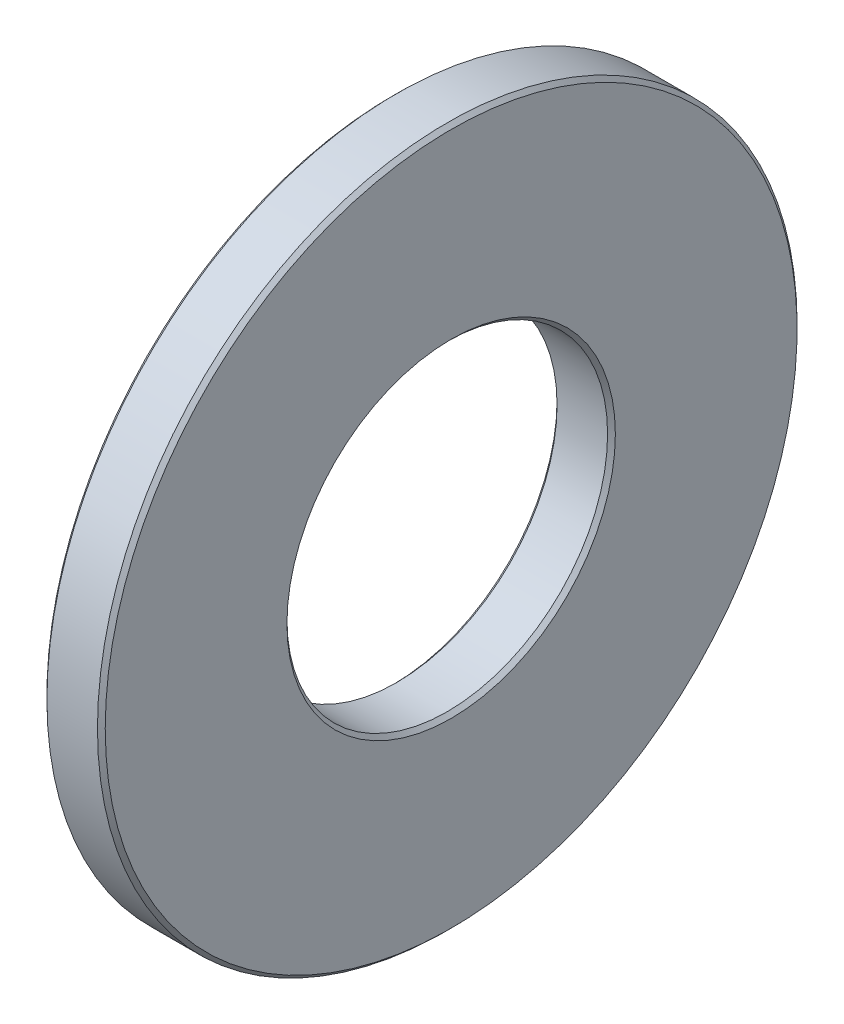
ISO-10303-21;
HEADER;
FILE_DESCRIPTION(('STEP AP214'),'2;1');
FILE_NAME('part.step','',(''),(''),'','','');
FILE_SCHEMA(('AUTOMOTIVE_DESIGN { 1 0 10303 214 1 1 1 1 }'));
ENDSEC;
DATA;
#1=APPLICATION_CONTEXT('core data for automotive mechanical design processes');
#2=APPLICATION_PROTOCOL_DEFINITION('international standard','automotive_design',2000,#1);
#3=PRODUCT_CONTEXT('',#1,'mechanical');
#4=PRODUCT('Part','Part','',(#3));
#5=PRODUCT_RELATED_PRODUCT_CATEGORY('part','',(#4));
#6=PRODUCT_DEFINITION_FORMATION('','',#4);
#7=PRODUCT_DEFINITION_CONTEXT('part definition',#1,'design');
#8=PRODUCT_DEFINITION('design','',#6,#7);
#9=PRODUCT_DEFINITION_SHAPE('','',#8);
#10=(LENGTH_UNIT() NAMED_UNIT(*) SI_UNIT(.MILLI.,.METRE.));
#11=(NAMED_UNIT(*) PLANE_ANGLE_UNIT() SI_UNIT($,.RADIAN.));
#12=(NAMED_UNIT(*) SI_UNIT($,.STERADIAN.) SOLID_ANGLE_UNIT());
#13=UNCERTAINTY_MEASURE_WITH_UNIT(LENGTH_MEASURE(1.E-05),#10,'distance_accuracy_value','');
#14=(GEOMETRIC_REPRESENTATION_CONTEXT(3) GLOBAL_UNCERTAINTY_ASSIGNED_CONTEXT((#13)) GLOBAL_UNIT_ASSIGNED_CONTEXT((#10,
#11,#12)) REPRESENTATION_CONTEXT('',''));
#15=CARTESIAN_POINT('',(0.,0.,0.));
#16=DIRECTION('',(0.,0.,1.));
#17=DIRECTION('',(1.,0.,0.));
#18=AXIS2_PLACEMENT_3D('',#15,#16,#17);
#19=CARTESIAN_POINT('',(0.,4.125,0.));
#20=DIRECTION('',(1.,0.,0.));
#21=DIRECTION('',(0.,0.,-1.));
#22=AXIS2_PLACEMENT_3D('',#19,#20,#21);
#23=PLANE('',#22);
#24=CARTESIAN_POINT('',(0.,0.,0.));
#25=DIRECTION('',(1.,0.,0.));
#26=DIRECTION('',(0.,0.,-1.));
#27=AXIS2_PLACEMENT_3D('',#24,#25,#26);
#28=CIRCLE('',#27,4.225);
#29=CARTESIAN_POINT('',(0.,0.,-4.225));
#30=VERTEX_POINT('',#29);
#31=EDGE_CURVE('E43',#30,#30,#28,.T.);
#32=ORIENTED_EDGE('',*,*,#31,.T.);
#33=EDGE_LOOP('',(#32));
#34=FACE_BOUND('',#33,.T.);
#35=CARTESIAN_POINT('',(0.,0.,0.));
#36=DIRECTION('',(1.,0.,0.));
#37=DIRECTION('',(0.,0.,-1.));
#38=AXIS2_PLACEMENT_3D('',#35,#36,#37);
#39=CIRCLE('',#38,8.9);
#40=CARTESIAN_POINT('',(0.,0.,-8.9));
#41=VERTEX_POINT('',#40);
#42=EDGE_CURVE('E47',#41,#41,#39,.F.);
#43=ORIENTED_EDGE('',*,*,#42,.T.);
#44=EDGE_LOOP('',(#43));
#45=FACE_BOUND('',#44,.T.);
#46=ADVANCED_FACE('F33',(#34,#45),#23,.F.);
#47=CARTESIAN_POINT('',(0.,0.,0.));
#48=DIRECTION('',(-1.,0.,0.));
#49=DIRECTION('',(0.,0.,1.));
#50=AXIS2_PLACEMENT_3D('',#47,#48,#49);
#51=CYLINDRICAL_SURFACE('',#50,9.);
#52=CARTESIAN_POINT('',(1.4,0.,0.));
#53=DIRECTION('',(-1.,0.,0.));
#54=DIRECTION('',(0.,0.,1.));
#55=AXIS2_PLACEMENT_3D('',#52,#53,#54);
#56=CIRCLE('',#55,9.);
#57=CARTESIAN_POINT('',(1.4,0.,9.));
#58=VERTEX_POINT('',#57);
#59=EDGE_CURVE('E10',#58,#58,#56,.T.);
#60=ORIENTED_EDGE('',*,*,#59,.T.);
#61=EDGE_LOOP('',(#60));
#62=FACE_BOUND('',#61,.T.);
#63=CARTESIAN_POINT('',(0.0999999999999977,0.,0.));
#64=DIRECTION('',(1.,0.,0.));
#65=DIRECTION('',(0.,0.,-1.));
#66=AXIS2_PLACEMENT_3D('',#63,#64,#65);
#67=CIRCLE('',#66,9.);
#68=CARTESIAN_POINT('',(0.0999999999999977,0.,-9.));
#69=VERTEX_POINT('',#68);
#70=EDGE_CURVE('E39',#69,#69,#67,.T.);
#71=ORIENTED_EDGE('',*,*,#70,.T.);
#72=EDGE_LOOP('',(#71));
#73=FACE_BOUND('',#72,.T.);
#74=ADVANCED_FACE('F83',(#62,#73),#51,.T.);
#75=CARTESIAN_POINT('',(1.5,4.125,0.));
#76=DIRECTION('',(-1.,0.,0.));
#77=DIRECTION('',(0.,0.,1.));
#78=AXIS2_PLACEMENT_3D('',#75,#76,#77);
#79=PLANE('',#78);
#80=CARTESIAN_POINT('',(1.5,0.,0.));
#81=DIRECTION('',(-1.,0.,0.));
#82=DIRECTION('',(0.,0.,1.));
#83=AXIS2_PLACEMENT_3D('',#80,#81,#82);
#84=CIRCLE('',#83,4.225);
#85=CARTESIAN_POINT('',(1.5,0.,-4.225));
#86=VERTEX_POINT('',#85);
#87=EDGE_CURVE('E58',#86,#86,#84,.T.);
#88=ORIENTED_EDGE('',*,*,#87,.T.);
#89=EDGE_LOOP('',(#88));
#90=FACE_BOUND('',#89,.T.);
#91=CARTESIAN_POINT('',(1.5,0.,0.));
#92=DIRECTION('',(-1.,0.,0.));
#93=DIRECTION('',(0.,0.,1.));
#94=AXIS2_PLACEMENT_3D('',#91,#92,#93);
#95=CIRCLE('',#94,8.9);
#96=CARTESIAN_POINT('',(1.5,0.,8.9));
#97=VERTEX_POINT('',#96);
#98=EDGE_CURVE('E61',#97,#97,#95,.F.);
#99=ORIENTED_EDGE('',*,*,#98,.T.);
#100=EDGE_LOOP('',(#99));
#101=FACE_BOUND('',#100,.T.);
#102=ADVANCED_FACE('F65',(#90,#101),#79,.F.);
#103=CARTESIAN_POINT('',(0.,0.,0.));
#104=DIRECTION('',(-1.,0.,0.));
#105=DIRECTION('',(0.,0.,1.));
#106=AXIS2_PLACEMENT_3D('',#103,#104,#105);
#107=CYLINDRICAL_SURFACE('',#106,4.125);
#108=CARTESIAN_POINT('',(1.4,0.,0.));
#109=DIRECTION('',(-1.,0.,0.));
#110=DIRECTION('',(0.,0.,1.));
#111=AXIS2_PLACEMENT_3D('',#108,#109,#110);
#112=CIRCLE('',#111,4.125);
#113=CARTESIAN_POINT('',(1.4,0.,-4.125));
#114=VERTEX_POINT('',#113);
#115=EDGE_CURVE('E52',#114,#114,#112,.F.);
#116=ORIENTED_EDGE('',*,*,#115,.T.);
#117=EDGE_LOOP('',(#116));
#118=FACE_BOUND('',#117,.T.);
#119=CARTESIAN_POINT('',(0.1,0.,0.));
#120=DIRECTION('',(1.,0.,0.));
#121=DIRECTION('',(0.,0.,-1.));
#122=AXIS2_PLACEMENT_3D('',#119,#120,#121);
#123=CIRCLE('',#122,4.125);
#124=CARTESIAN_POINT('',(0.1,0.,-4.125));
#125=VERTEX_POINT('',#124);
#126=EDGE_CURVE('E55',#125,#125,#123,.F.);
#127=ORIENTED_EDGE('',*,*,#126,.T.);
#128=EDGE_LOOP('',(#127));
#129=FACE_BOUND('',#128,.T.);
#130=ADVANCED_FACE('F95',(#118,#129),#107,.F.);
#131=CARTESIAN_POINT('',(1.5,0.,0.));
#132=DIRECTION('',(1.,0.,0.));
#133=DIRECTION('',(0.,0.,-1.));
#134=AXIS2_PLACEMENT_3D('',#131,#132,#133);
#135=CONICAL_SURFACE('',#134,4.225,0.78539816339745);
#136=CARTESIAN_POINT('',(1.4,0.,-4.125));
#137=CARTESIAN_POINT('',(1.40104166666667,0.,-4.12604166666667));
#138=CARTESIAN_POINT('',(1.40208333333333,0.,-4.12708333333333));
#139=CARTESIAN_POINT('',(1.40416666666667,0.,-4.12916666666667));
#140=CARTESIAN_POINT('',(1.40520833333333,0.,-4.13020833333333));
#141=CARTESIAN_POINT('',(1.40729166666667,0.,-4.13229166666667));
#142=CARTESIAN_POINT('',(1.40833333333333,0.,-4.13333333333333));
#143=CARTESIAN_POINT('',(1.41041666666667,0.,-4.13541666666667));
#144=CARTESIAN_POINT('',(1.41145833333333,0.,-4.13645833333333));
#145=CARTESIAN_POINT('',(1.41354166666667,0.,-4.13854166666667));
#146=CARTESIAN_POINT('',(1.41458333333333,0.,-4.13958333333333));
#147=CARTESIAN_POINT('',(1.41666666666667,0.,-4.14166666666667));
#148=CARTESIAN_POINT('',(1.41770833333333,0.,-4.14270833333333));
#149=CARTESIAN_POINT('',(1.41979166666667,0.,-4.14479166666667));
#150=CARTESIAN_POINT('',(1.42083333333333,0.,-4.14583333333333));
#151=CARTESIAN_POINT('',(1.42291666666667,0.,-4.14791666666667));
#152=CARTESIAN_POINT('',(1.42395833333333,0.,-4.14895833333333));
#153=CARTESIAN_POINT('',(1.42604166666667,0.,-4.15104166666667));
#154=CARTESIAN_POINT('',(1.42708333333333,0.,-4.15208333333333));
#155=CARTESIAN_POINT('',(1.42916666666667,0.,-4.15416666666667));
#156=CARTESIAN_POINT('',(1.43020833333333,0.,-4.15520833333333));
#157=CARTESIAN_POINT('',(1.43229166666667,0.,-4.15729166666667));
#158=CARTESIAN_POINT('',(1.43333333333333,0.,-4.15833333333333));
#159=CARTESIAN_POINT('',(1.43541666666667,0.,-4.16041666666667));
#160=CARTESIAN_POINT('',(1.43645833333333,0.,-4.16145833333333));
#161=CARTESIAN_POINT('',(1.43854166666667,0.,-4.16354166666667));
#162=CARTESIAN_POINT('',(1.43958333333333,0.,-4.16458333333333));
#163=CARTESIAN_POINT('',(1.44166666666667,0.,-4.16666666666667));
#164=CARTESIAN_POINT('',(1.44270833333333,0.,-4.16770833333333));
#165=CARTESIAN_POINT('',(1.44479166666667,0.,-4.16979166666667));
#166=CARTESIAN_POINT('',(1.44583333333333,0.,-4.17083333333333));
#167=CARTESIAN_POINT('',(1.44791666666667,0.,-4.17291666666667));
#168=CARTESIAN_POINT('',(1.44895833333333,0.,-4.17395833333333));
#169=CARTESIAN_POINT('',(1.45104166666667,0.,-4.17604166666667));
#170=CARTESIAN_POINT('',(1.45208333333333,0.,-4.17708333333333));
#171=CARTESIAN_POINT('',(1.45416666666667,0.,-4.17916666666667));
#172=CARTESIAN_POINT('',(1.45520833333333,0.,-4.18020833333333));
#173=CARTESIAN_POINT('',(1.45729166666667,0.,-4.18229166666667));
#174=CARTESIAN_POINT('',(1.45833333333333,0.,-4.18333333333333));
#175=CARTESIAN_POINT('',(1.46041666666667,0.,-4.18541666666667));
#176=CARTESIAN_POINT('',(1.46145833333333,0.,-4.18645833333333));
#177=CARTESIAN_POINT('',(1.46354166666667,0.,-4.18854166666667));
#178=CARTESIAN_POINT('',(1.46458333333333,0.,-4.18958333333333));
#179=CARTESIAN_POINT('',(1.46666666666667,0.,-4.19166666666667));
#180=CARTESIAN_POINT('',(1.46770833333333,0.,-4.19270833333333));
#181=CARTESIAN_POINT('',(1.46979166666667,0.,-4.19479166666667));
#182=CARTESIAN_POINT('',(1.47083333333333,0.,-4.19583333333333));
#183=CARTESIAN_POINT('',(1.47291666666667,0.,-4.19791666666667));
#184=CARTESIAN_POINT('',(1.47395833333333,0.,-4.19895833333333));
#185=CARTESIAN_POINT('',(1.47604166666667,0.,-4.20104166666667));
#186=CARTESIAN_POINT('',(1.47708333333333,0.,-4.20208333333333));
#187=CARTESIAN_POINT('',(1.47916666666667,0.,-4.20416666666667));
#188=CARTESIAN_POINT('',(1.48020833333333,0.,-4.20520833333333));
#189=CARTESIAN_POINT('',(1.48229166666667,0.,-4.20729166666667));
#190=CARTESIAN_POINT('',(1.48333333333333,0.,-4.20833333333333));
#191=CARTESIAN_POINT('',(1.48541666666667,0.,-4.21041666666667));
#192=CARTESIAN_POINT('',(1.48645833333333,0.,-4.21145833333333));
#193=CARTESIAN_POINT('',(1.48854166666667,0.,-4.21354166666667));
#194=CARTESIAN_POINT('',(1.48958333333333,0.,-4.21458333333333));
#195=CARTESIAN_POINT('',(1.49166666666667,0.,-4.21666666666667));
#196=CARTESIAN_POINT('',(1.49270833333333,0.,-4.21770833333333));
#197=CARTESIAN_POINT('',(1.49479166666667,0.,-4.21979166666667));
#198=CARTESIAN_POINT('',(1.49583333333333,0.,-4.22083333333333));
#199=CARTESIAN_POINT('',(1.49791666666667,0.,-4.22291666666667));
#200=CARTESIAN_POINT('',(1.49895833333333,0.,-4.22395833333333));
#201=CARTESIAN_POINT('',(1.5,0.,-4.225));
#202=B_SPLINE_CURVE_WITH_KNOTS('',3,(#136,#137,#138,#139,#140,#141,#142,#143,#144,#145,#146,
#147,#148,#149,#150,#151,#152,#153,#154,#155,#156,#157,#158,#159,#160,#161,#162,#163,#164,#165,
#166,#167,#168,#169,#170,#171,#172,#173,#174,#175,#176,#177,#178,#179,#180,#181,#182,#183,#184,
#185,#186,#187,#188,#189,#190,#191,#192,#193,#194,#195,#196,#197,#198,#199,#200,#201),
.UNSPECIFIED.,.F.,.F.,(4,2,2,2,2,2,2,2,2,2,2,2,2,2,2,2,2,2,2,2,2,2,2,2,2,2,2,2,2,2,2,2,4),(0.,
0.0044194173824162,0.00883883476483194,0.0132582521472475,0.0176776695296639,0.0220970869120795,
0.0265165042944958,0.0309359216769116,0.0353553390593272,0.0397747564417435,0.0441941738241591,
0.0486135912065755,0.0530330085889911,0.0574524259714068,0.061871843353823,0.0662912607362387,
0.0707106781186551,0.0751300955010707,0.0795495128834864,0.0839689302659026,0.0883883476483184,
0.0928077650307346,0.0972271824131503,0.101646599795566,0.106066017177982,0.110485434560398,
0.114904851942814,0.11932426932523,0.123743686707646,0.128163104090062,0.132582521472477,
0.137001938854894,0.141421356237309),.UNSPECIFIED.);
#203=EDGE_CURVE('BSEAM79',#114,#86,#202,.T.);
#204=ORIENTED_EDGE('',*,*,#115,.F.);
#205=ORIENTED_EDGE('',*,*,#87,.F.);
#206=ORIENTED_EDGE('',*,*,#203,.T.);
#207=ORIENTED_EDGE('',*,*,#203,.F.);
#208=EDGE_LOOP('',(#204,#206,#205,#207));
#209=FACE_BOUND('',#208,.T.);
#210=ADVANCED_FACE('F79',(#209),#135,.F.);
#211=CARTESIAN_POINT('',(0.1,0.,0.));
#212=DIRECTION('',(-1.,0.,0.));
#213=DIRECTION('',(0.,0.,1.));
#214=AXIS2_PLACEMENT_3D('',#211,#212,#213);
#215=CONICAL_SURFACE('',#214,4.125,0.785398163397448);
#216=ORIENTED_EDGE('',*,*,#31,.F.);
#217=EDGE_LOOP('',(#216));
#218=FACE_BOUND('',#217,.T.);
#219=ORIENTED_EDGE('',*,*,#126,.F.);
#220=EDGE_LOOP('',(#219));
#221=FACE_BOUND('',#220,.T.);
#222=ADVANCED_FACE('F71',(#218,#221),#215,.F.);
#223=CARTESIAN_POINT('',(1.4,0.,0.));
#224=DIRECTION('',(-1.,0.,0.));
#225=DIRECTION('',(0.,0.,1.));
#226=AXIS2_PLACEMENT_3D('',#223,#224,#225);
#227=CONICAL_SURFACE('',#226,9.,0.785398163397455);
#228=ORIENTED_EDGE('',*,*,#98,.F.);
#229=EDGE_LOOP('',(#228));
#230=FACE_BOUND('',#229,.T.);
#231=ORIENTED_EDGE('',*,*,#59,.F.);
#232=EDGE_LOOP('',(#231));
#233=FACE_BOUND('',#232,.T.);
#234=ADVANCED_FACE('F67',(#230,#233),#227,.T.);
#235=CARTESIAN_POINT('',(0.,0.,0.));
#236=DIRECTION('',(1.,0.,0.));
#237=DIRECTION('',(0.,0.,-1.));
#238=AXIS2_PLACEMENT_3D('',#235,#236,#237);
#239=CONICAL_SURFACE('',#238,8.9,0.785398163397457);
#240=ORIENTED_EDGE('',*,*,#70,.F.);
#241=EDGE_LOOP('',(#240));
#242=FACE_BOUND('',#241,.T.);
#243=ORIENTED_EDGE('',*,*,#42,.F.);
#244=EDGE_LOOP('',(#243));
#245=FACE_BOUND('',#244,.T.);
#246=ADVANCED_FACE('F70',(#242,#245),#239,.T.);
#247=CLOSED_SHELL('',(#46,#74,#102,#130,#210,#222,#234,#246));
#248=MANIFOLD_SOLID_BREP('B2',#247);
#249=ADVANCED_BREP_SHAPE_REPRESENTATION('',(#18,#248),#14);
#250=SHAPE_DEFINITION_REPRESENTATION(#9,#249);
ENDSEC;
END-ISO-10303-21;
